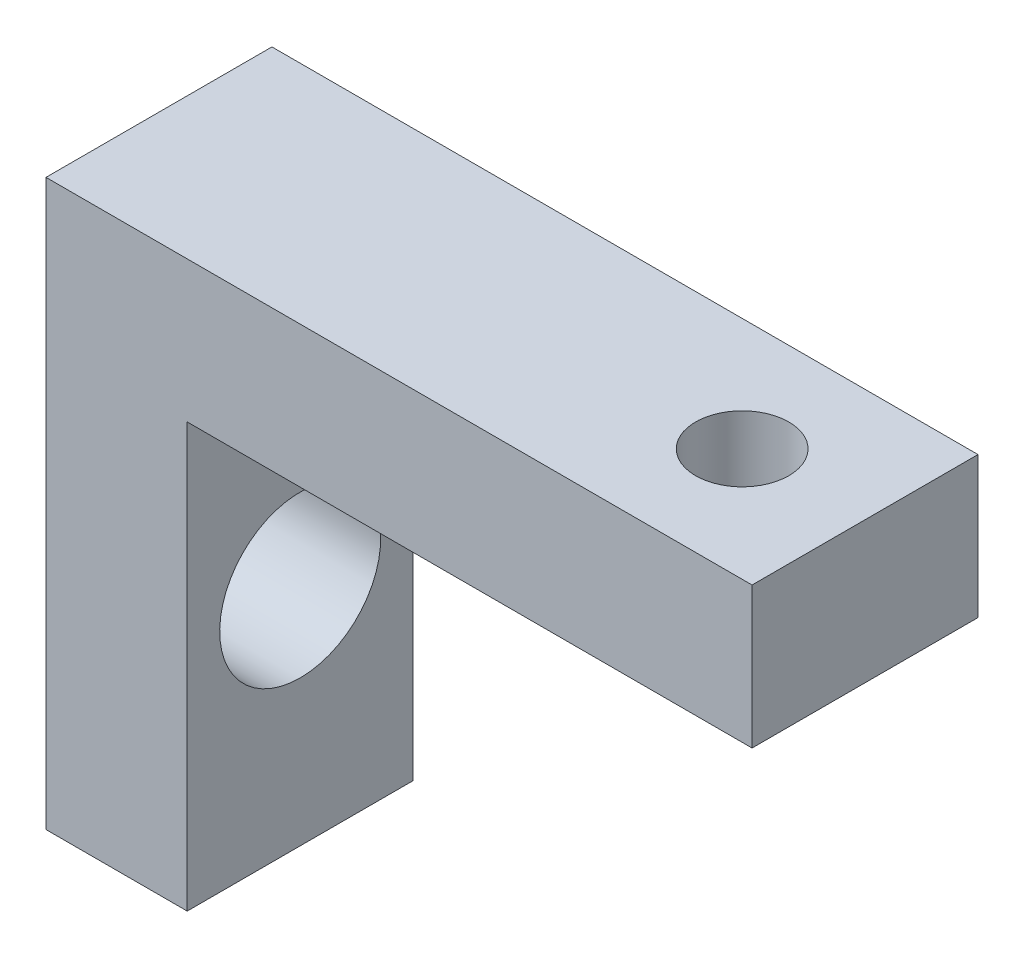
ISO-10303-21;
HEADER;
FILE_DESCRIPTION(('STEP AP214'),'2;1');
FILE_NAME('part.step','',(''),(''),'','','');
FILE_SCHEMA(('AUTOMOTIVE_DESIGN { 1 0 10303 214 1 1 1 1 }'));
ENDSEC;
DATA;
#1=APPLICATION_CONTEXT('core data for automotive mechanical design processes');
#2=APPLICATION_PROTOCOL_DEFINITION('international standard','automotive_design',2000,#1);
#3=PRODUCT_CONTEXT('',#1,'mechanical');
#4=PRODUCT('Part','Part','',(#3));
#5=PRODUCT_RELATED_PRODUCT_CATEGORY('part','',(#4));
#6=PRODUCT_DEFINITION_FORMATION('','',#4);
#7=PRODUCT_DEFINITION_CONTEXT('part definition',#1,'design');
#8=PRODUCT_DEFINITION('design','',#6,#7);
#9=PRODUCT_DEFINITION_SHAPE('','',#8);
#10=(LENGTH_UNIT() NAMED_UNIT(*) SI_UNIT(.MILLI.,.METRE.));
#11=(NAMED_UNIT(*) PLANE_ANGLE_UNIT() SI_UNIT($,.RADIAN.));
#12=(NAMED_UNIT(*) SI_UNIT($,.STERADIAN.) SOLID_ANGLE_UNIT());
#13=UNCERTAINTY_MEASURE_WITH_UNIT(LENGTH_MEASURE(1.E-05),#10,'distance_accuracy_value','');
#14=(GEOMETRIC_REPRESENTATION_CONTEXT(3) GLOBAL_UNCERTAINTY_ASSIGNED_CONTEXT((#13)) GLOBAL_UNIT_ASSIGNED_CONTEXT((#10,
#11,#12)) REPRESENTATION_CONTEXT('',''));
#15=CARTESIAN_POINT('',(0.,0.,0.));
#16=DIRECTION('',(0.,0.,1.));
#17=DIRECTION('',(1.,0.,0.));
#18=AXIS2_PLACEMENT_3D('',#15,#16,#17);
#19=CARTESIAN_POINT('',(20.,0.,8.));
#20=DIRECTION('',(0.,1.,0.));
#21=DIRECTION('',(-1.,0.,0.));
#22=AXIS2_PLACEMENT_3D('',#19,#20,#21);
#23=PLANE('',#22);
#24=CARTESIAN_POINT('',(15.65,0.,4.));
#25=DIRECTION('',(0.,-1.,0.));
#26=DIRECTION('',(1.,0.,0.));
#27=AXIS2_PLACEMENT_3D('',#24,#25,#26);
#28=CIRCLE('',#27,1.65);
#29=CARTESIAN_POINT('',(17.3,0.,4.));
#30=VERTEX_POINT('',#29);
#31=EDGE_CURVE('E158',#30,#30,#28,.T.);
#32=ORIENTED_EDGE('',*,*,#31,.F.);
#33=EDGE_LOOP('',(#32));
#34=FACE_BOUND('',#33,.T.);
#35=DIRECTION('',(1.,0.,0.));
#36=VECTOR('',#35,1.);
#37=CARTESIAN_POINT('',(20.,0.,0.));
#38=LINE('',#37,#36);
#39=CARTESIAN_POINT('',(0.,0.,0.));
#40=VERTEX_POINT('',#39);
#41=CARTESIAN_POINT('',(20.,0.,0.));
#42=VERTEX_POINT('',#41);
#43=EDGE_CURVE('E130',#40,#42,#38,.T.);
#44=ORIENTED_EDGE('',*,*,#43,.T.);
#45=DIRECTION('',(0.,0.,-1.));
#46=VECTOR('',#45,1.);
#47=CARTESIAN_POINT('',(20.,0.,8.));
#48=LINE('',#47,#46);
#49=CARTESIAN_POINT('',(20.,0.,8.));
#50=VERTEX_POINT('',#49);
#51=EDGE_CURVE('E11',#50,#42,#48,.T.);
#52=ORIENTED_EDGE('',*,*,#51,.F.);
#53=DIRECTION('',(1.,0.,0.));
#54=VECTOR('',#53,1.);
#55=CARTESIAN_POINT('',(20.,0.,8.));
#56=LINE('',#55,#54);
#57=CARTESIAN_POINT('',(0.,0.,8.));
#58=VERTEX_POINT('',#57);
#59=EDGE_CURVE('E147',#58,#50,#56,.T.);
#60=ORIENTED_EDGE('',*,*,#59,.F.);
#61=DIRECTION('',(0.,0.,-1.));
#62=VECTOR('',#61,1.);
#63=CARTESIAN_POINT('',(0.,0.,8.));
#64=LINE('',#63,#62);
#65=EDGE_CURVE('E126',#58,#40,#64,.T.);
#66=ORIENTED_EDGE('',*,*,#65,.T.);
#67=EDGE_LOOP('',(#44,#52,#60,#66));
#68=FACE_BOUND('',#67,.T.);
#69=ADVANCED_FACE('F39',(#34,#68),#23,.F.);
#70=CARTESIAN_POINT('',(20.,5.,8.));
#71=DIRECTION('',(-1.,0.,0.));
#72=DIRECTION('',(0.,-1.,0.));
#73=AXIS2_PLACEMENT_3D('',#70,#71,#72);
#74=PLANE('',#73);
#75=DIRECTION('',(0.,1.,0.));
#76=VECTOR('',#75,1.);
#77=CARTESIAN_POINT('',(20.,5.,0.));
#78=LINE('',#77,#76);
#79=CARTESIAN_POINT('',(20.,5.,0.));
#80=VERTEX_POINT('',#79);
#81=EDGE_CURVE('E134',#42,#80,#78,.T.);
#82=ORIENTED_EDGE('',*,*,#81,.T.);
#83=DIRECTION('',(0.,0.,-1.));
#84=VECTOR('',#83,1.);
#85=CARTESIAN_POINT('',(20.,5.,8.));
#86=LINE('',#85,#84);
#87=CARTESIAN_POINT('',(20.,5.,8.));
#88=VERTEX_POINT('',#87);
#89=EDGE_CURVE('E49',#88,#80,#86,.T.);
#90=ORIENTED_EDGE('',*,*,#89,.F.);
#91=DIRECTION('',(0.,1.,0.));
#92=VECTOR('',#91,1.);
#93=CARTESIAN_POINT('',(20.,5.,8.));
#94=LINE('',#93,#92);
#95=EDGE_CURVE('E95',#50,#88,#94,.T.);
#96=ORIENTED_EDGE('',*,*,#95,.F.);
#97=ORIENTED_EDGE('',*,*,#51,.T.);
#98=EDGE_LOOP('',(#82,#90,#96,#97));
#99=FACE_BOUND('',#98,.T.);
#100=ADVANCED_FACE('F177',(#99),#74,.F.);
#101=CARTESIAN_POINT('',(-5.,5.,8.));
#102=DIRECTION('',(0.,-1.,0.));
#103=DIRECTION('',(1.,0.,0.));
#104=AXIS2_PLACEMENT_3D('',#101,#102,#103);
#105=PLANE('',#104);
#106=CARTESIAN_POINT('',(15.65,5.,4.));
#107=DIRECTION('',(0.,-1.,0.));
#108=DIRECTION('',(1.,0.,0.));
#109=AXIS2_PLACEMENT_3D('',#106,#107,#108);
#110=CIRCLE('',#109,1.65);
#111=CARTESIAN_POINT('',(17.3,5.,4.));
#112=VERTEX_POINT('',#111);
#113=EDGE_CURVE('E135',#112,#112,#110,.T.);
#114=ORIENTED_EDGE('',*,*,#113,.T.);
#115=EDGE_LOOP('',(#114));
#116=FACE_BOUND('',#115,.T.);
#117=DIRECTION('',(-1.,0.,0.));
#118=VECTOR('',#117,1.);
#119=CARTESIAN_POINT('',(-5.,5.,0.));
#120=LINE('',#119,#118);
#121=CARTESIAN_POINT('',(-5.,5.,0.));
#122=VERTEX_POINT('',#121);
#123=EDGE_CURVE('E138',#80,#122,#120,.T.);
#124=ORIENTED_EDGE('',*,*,#123,.T.);
#125=DIRECTION('',(0.,0.,-1.));
#126=VECTOR('',#125,1.);
#127=CARTESIAN_POINT('',(-5.,5.,8.));
#128=LINE('',#127,#126);
#129=CARTESIAN_POINT('',(-5.,5.,8.));
#130=VERTEX_POINT('',#129);
#131=EDGE_CURVE('E119',#130,#122,#128,.T.);
#132=ORIENTED_EDGE('',*,*,#131,.F.);
#133=DIRECTION('',(-1.,0.,0.));
#134=VECTOR('',#133,1.);
#135=CARTESIAN_POINT('',(-5.,5.,8.));
#136=LINE('',#135,#134);
#137=EDGE_CURVE('E108',#88,#130,#136,.T.);
#138=ORIENTED_EDGE('',*,*,#137,.F.);
#139=ORIENTED_EDGE('',*,*,#89,.T.);
#140=EDGE_LOOP('',(#124,#132,#138,#139));
#141=FACE_BOUND('',#140,.T.);
#142=ADVANCED_FACE('F180',(#116,#141),#105,.F.);
#143=CARTESIAN_POINT('',(-5.,-15.,8.));
#144=DIRECTION('',(1.,0.,0.));
#145=DIRECTION('',(0.,1.,0.));
#146=AXIS2_PLACEMENT_3D('',#143,#144,#145);
#147=PLANE('',#146);
#148=CARTESIAN_POINT('',(-5.,-7.,4.));
#149=DIRECTION('',(-1.,0.,0.));
#150=DIRECTION('',(0.,-1.,0.));
#151=AXIS2_PLACEMENT_3D('',#148,#149,#150);
#152=CIRCLE('',#151,2.85);
#153=CARTESIAN_POINT('',(-5.,-9.85,4.));
#154=VERTEX_POINT('',#153);
#155=EDGE_CURVE('E168',#154,#154,#152,.T.);
#156=ORIENTED_EDGE('',*,*,#155,.F.);
#157=EDGE_LOOP('',(#156));
#158=FACE_BOUND('',#157,.T.);
#159=DIRECTION('',(0.,-1.,0.));
#160=VECTOR('',#159,1.);
#161=CARTESIAN_POINT('',(-5.,-15.,0.));
#162=LINE('',#161,#160);
#163=CARTESIAN_POINT('',(-5.,-15.,0.));
#164=VERTEX_POINT('',#163);
#165=EDGE_CURVE('E117',#122,#164,#162,.T.);
#166=ORIENTED_EDGE('',*,*,#165,.T.);
#167=DIRECTION('',(0.,0.,-1.));
#168=VECTOR('',#167,1.);
#169=CARTESIAN_POINT('',(-5.,-15.,8.));
#170=LINE('',#169,#168);
#171=CARTESIAN_POINT('',(-5.,-15.,8.));
#172=VERTEX_POINT('',#171);
#173=EDGE_CURVE('E114',#172,#164,#170,.T.);
#174=ORIENTED_EDGE('',*,*,#173,.F.);
#175=DIRECTION('',(0.,-1.,0.));
#176=VECTOR('',#175,1.);
#177=CARTESIAN_POINT('',(-5.,-15.,8.));
#178=LINE('',#177,#176);
#179=EDGE_CURVE('E102',#130,#172,#178,.T.);
#180=ORIENTED_EDGE('',*,*,#179,.F.);
#181=ORIENTED_EDGE('',*,*,#131,.T.);
#182=EDGE_LOOP('',(#166,#174,#180,#181));
#183=FACE_BOUND('',#182,.T.);
#184=ADVANCED_FACE('F115',(#158,#183),#147,.F.);
#185=CARTESIAN_POINT('',(0.,-15.,8.));
#186=DIRECTION('',(0.,1.,0.));
#187=DIRECTION('',(-1.,0.,0.));
#188=AXIS2_PLACEMENT_3D('',#185,#186,#187);
#189=PLANE('',#188);
#190=DIRECTION('',(1.,0.,0.));
#191=VECTOR('',#190,1.);
#192=CARTESIAN_POINT('',(0.,-15.,0.));
#193=LINE('',#192,#191);
#194=CARTESIAN_POINT('',(0.,-15.,0.));
#195=VERTEX_POINT('',#194);
#196=EDGE_CURVE('E81',#164,#195,#193,.T.);
#197=ORIENTED_EDGE('',*,*,#196,.T.);
#198=DIRECTION('',(0.,0.,-1.));
#199=VECTOR('',#198,1.);
#200=CARTESIAN_POINT('',(0.,-15.,8.));
#201=LINE('',#200,#199);
#202=CARTESIAN_POINT('',(0.,-15.,8.));
#203=VERTEX_POINT('',#202);
#204=EDGE_CURVE('E120',#203,#195,#201,.T.);
#205=ORIENTED_EDGE('',*,*,#204,.F.);
#206=DIRECTION('',(1.,0.,0.));
#207=VECTOR('',#206,1.);
#208=CARTESIAN_POINT('',(0.,-15.,8.));
#209=LINE('',#208,#207);
#210=EDGE_CURVE('E106',#172,#203,#209,.T.);
#211=ORIENTED_EDGE('',*,*,#210,.F.);
#212=ORIENTED_EDGE('',*,*,#173,.T.);
#213=EDGE_LOOP('',(#197,#205,#211,#212));
#214=FACE_BOUND('',#213,.T.);
#215=ADVANCED_FACE('F122',(#214),#189,.F.);
#216=CARTESIAN_POINT('',(0.,0.,8.));
#217=DIRECTION('',(-1.,0.,0.));
#218=DIRECTION('',(0.,-1.,0.));
#219=AXIS2_PLACEMENT_3D('',#216,#217,#218);
#220=PLANE('',#219);
#221=CARTESIAN_POINT('',(0.,-7.,4.));
#222=DIRECTION('',(-1.,0.,0.));
#223=DIRECTION('',(0.,-1.,0.));
#224=AXIS2_PLACEMENT_3D('',#221,#222,#223);
#225=CIRCLE('',#224,2.85);
#226=CARTESIAN_POINT('',(0.,-9.85,4.));
#227=VERTEX_POINT('',#226);
#228=EDGE_CURVE('E42',#227,#227,#225,.T.);
#229=ORIENTED_EDGE('',*,*,#228,.T.);
#230=EDGE_LOOP('',(#229));
#231=FACE_BOUND('',#230,.T.);
#232=DIRECTION('',(0.,1.,0.));
#233=VECTOR('',#232,1.);
#234=CARTESIAN_POINT('',(0.,0.,0.));
#235=LINE('',#234,#233);
#236=EDGE_CURVE('E87',#195,#40,#235,.T.);
#237=ORIENTED_EDGE('',*,*,#236,.T.);
#238=ORIENTED_EDGE('',*,*,#65,.F.);
#239=DIRECTION('',(0.,1.,0.));
#240=VECTOR('',#239,1.);
#241=CARTESIAN_POINT('',(0.,0.,8.));
#242=LINE('',#241,#240);
#243=EDGE_CURVE('E58',#203,#58,#242,.T.);
#244=ORIENTED_EDGE('',*,*,#243,.F.);
#245=ORIENTED_EDGE('',*,*,#204,.T.);
#246=EDGE_LOOP('',(#237,#238,#244,#245));
#247=FACE_BOUND('',#246,.T.);
#248=ADVANCED_FACE('F185',(#231,#247),#220,.F.);
#249=CARTESIAN_POINT('',(0.,0.,8.));
#250=DIRECTION('',(0.,0.,1.));
#251=DIRECTION('',(1.,0.,0.));
#252=AXIS2_PLACEMENT_3D('',#249,#250,#251);
#253=PLANE('',#252);
#254=ORIENTED_EDGE('',*,*,#59,.T.);
#255=ORIENTED_EDGE('',*,*,#95,.T.);
#256=ORIENTED_EDGE('',*,*,#137,.T.);
#257=ORIENTED_EDGE('',*,*,#179,.T.);
#258=ORIENTED_EDGE('',*,*,#210,.T.);
#259=ORIENTED_EDGE('',*,*,#243,.T.);
#260=EDGE_LOOP('',(#254,#255,#256,#257,#258,#259));
#261=FACE_BOUND('',#260,.T.);
#262=ADVANCED_FACE('F104',(#261),#253,.T.);
#263=CARTESIAN_POINT('',(0.,0.,0.));
#264=DIRECTION('',(0.,0.,1.));
#265=DIRECTION('',(1.,0.,0.));
#266=AXIS2_PLACEMENT_3D('',#263,#264,#265);
#267=PLANE('',#266);
#268=ORIENTED_EDGE('',*,*,#43,.F.);
#269=ORIENTED_EDGE('',*,*,#236,.F.);
#270=ORIENTED_EDGE('',*,*,#196,.F.);
#271=ORIENTED_EDGE('',*,*,#165,.F.);
#272=ORIENTED_EDGE('',*,*,#123,.F.);
#273=ORIENTED_EDGE('',*,*,#81,.F.);
#274=EDGE_LOOP('',(#268,#269,#270,#271,#272,#273));
#275=FACE_BOUND('',#274,.T.);
#276=ADVANCED_FACE('F183',(#275),#267,.F.);
#277=CARTESIAN_POINT('',(15.65,8.,4.));
#278=DIRECTION('',(0.,-1.,0.));
#279=DIRECTION('',(1.,0.,0.));
#280=AXIS2_PLACEMENT_3D('',#277,#278,#279);
#281=CYLINDRICAL_SURFACE('',#280,1.65);
#282=ORIENTED_EDGE('',*,*,#31,.T.);
#283=EDGE_LOOP('',(#282));
#284=FACE_BOUND('',#283,.T.);
#285=ORIENTED_EDGE('',*,*,#113,.F.);
#286=EDGE_LOOP('',(#285));
#287=FACE_BOUND('',#286,.T.);
#288=ADVANCED_FACE('F217',(#284,#287),#281,.F.);
#289=CARTESIAN_POINT('',(3.,-7.,4.));
#290=DIRECTION('',(-1.,0.,0.));
#291=DIRECTION('',(0.,-1.,0.));
#292=AXIS2_PLACEMENT_3D('',#289,#290,#291);
#293=CYLINDRICAL_SURFACE('',#292,2.85);
#294=ORIENTED_EDGE('',*,*,#155,.T.);
#295=EDGE_LOOP('',(#294));
#296=FACE_BOUND('',#295,.T.);
#297=ORIENTED_EDGE('',*,*,#228,.F.);
#298=EDGE_LOOP('',(#297));
#299=FACE_BOUND('',#298,.T.);
#300=ADVANCED_FACE('F214',(#296,#299),#293,.F.);
#301=CLOSED_SHELL('',(#69,#100,#142,#184,#215,#248,#262,#276,#288,#300));
#302=MANIFOLD_SOLID_BREP('B2',#301);
#303=ADVANCED_BREP_SHAPE_REPRESENTATION('',(#18,#302),#14);
#304=SHAPE_DEFINITION_REPRESENTATION(#9,#303);
ENDSEC;
END-ISO-10303-21;
